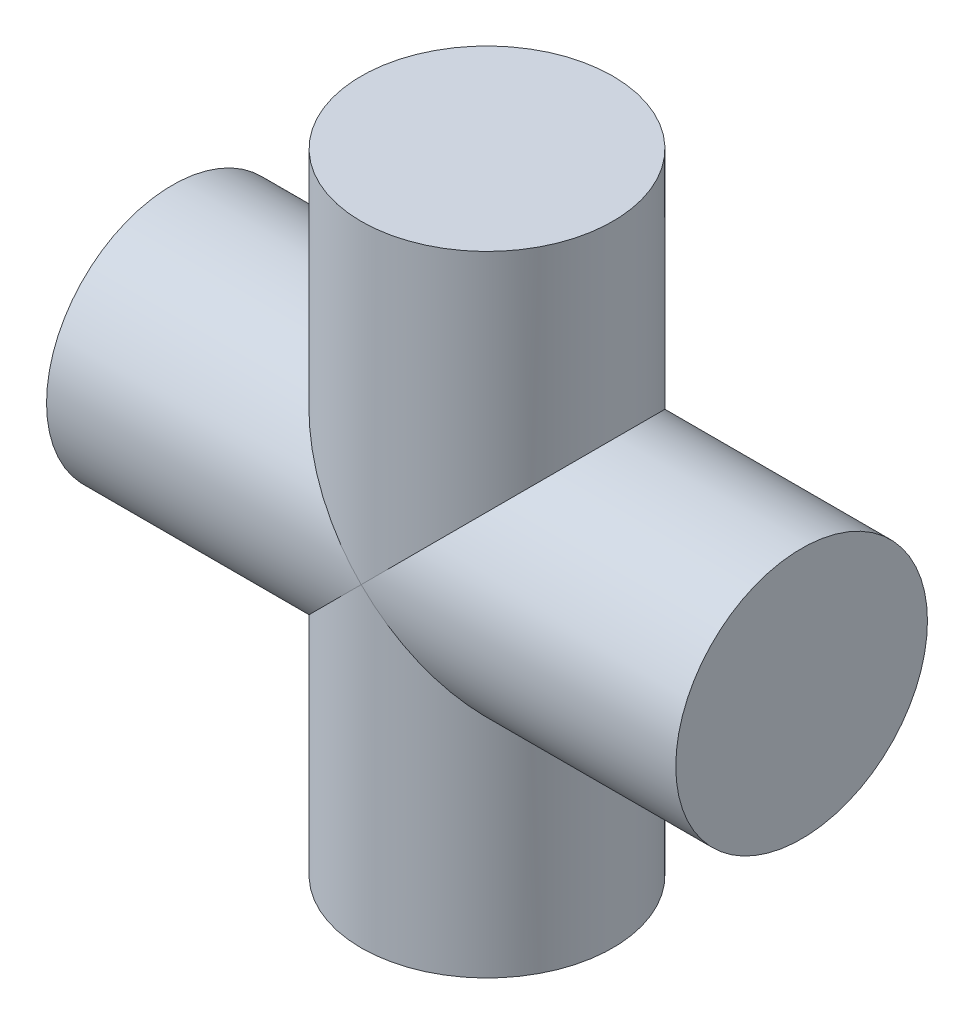
ISO-10303-21;
HEADER;
FILE_DESCRIPTION(('STEP AP214'),'2;1');
FILE_NAME('part.step','',(''),(''),'','','');
FILE_SCHEMA(('AUTOMOTIVE_DESIGN { 1 0 10303 214 1 1 1 1 }'));
ENDSEC;
DATA;
#1=APPLICATION_CONTEXT('core data for automotive mechanical design processes');
#2=APPLICATION_PROTOCOL_DEFINITION('international standard','automotive_design',2000,#1);
#3=PRODUCT_CONTEXT('',#1,'mechanical');
#4=PRODUCT('Part','Part','',(#3));
#5=PRODUCT_RELATED_PRODUCT_CATEGORY('part','',(#4));
#6=PRODUCT_DEFINITION_FORMATION('','',#4);
#7=PRODUCT_DEFINITION_CONTEXT('part definition',#1,'design');
#8=PRODUCT_DEFINITION('design','',#6,#7);
#9=PRODUCT_DEFINITION_SHAPE('','',#8);
#10=(LENGTH_UNIT() NAMED_UNIT(*) SI_UNIT(.MILLI.,.METRE.));
#11=(NAMED_UNIT(*) PLANE_ANGLE_UNIT() SI_UNIT($,.RADIAN.));
#12=(NAMED_UNIT(*) SI_UNIT($,.STERADIAN.) SOLID_ANGLE_UNIT());
#13=UNCERTAINTY_MEASURE_WITH_UNIT(LENGTH_MEASURE(1.E-05),#10,'distance_accuracy_value','');
#14=(GEOMETRIC_REPRESENTATION_CONTEXT(3) GLOBAL_UNCERTAINTY_ASSIGNED_CONTEXT((#13)) GLOBAL_UNIT_ASSIGNED_CONTEXT((#10,
#11,#12)) REPRESENTATION_CONTEXT('',''));
#15=CARTESIAN_POINT('',(0.,0.,0.));
#16=DIRECTION('',(0.,0.,1.));
#17=DIRECTION('',(1.,0.,0.));
#18=AXIS2_PLACEMENT_3D('',#15,#16,#17);
#19=CARTESIAN_POINT('',(0.,-20.,0.));
#20=DIRECTION('',(0.,1.,0.));
#21=DIRECTION('',(0.,0.,1.));
#22=AXIS2_PLACEMENT_3D('',#19,#20,#21);
#23=CYLINDRICAL_SURFACE('',#22,8.);
#24=CARTESIAN_POINT('',(0.,0.,0.));
#25=DIRECTION('',(0.707106781186547,0.707106781186547,0.));
#26=DIRECTION('',(-0.707106781186547,0.707106781186547,0.));
#27=AXIS2_PLACEMENT_3D('',#24,#25,#26);
#28=ELLIPSE('',#27,11.3137084989848,8.);
#29=CARTESIAN_POINT('',(0.,0.,8.));
#30=VERTEX_POINT('',#29);
#31=CARTESIAN_POINT('',(0.,0.,-8.));
#32=VERTEX_POINT('',#31);
#33=EDGE_CURVE('E47',#30,#32,#28,.T.);
#34=ORIENTED_EDGE('',*,*,#33,.F.);
#35=CARTESIAN_POINT('',(0.,0.,0.));
#36=DIRECTION('',(-0.707106781186547,0.707106781186547,0.));
#37=DIRECTION('',(0.707106781186547,0.707106781186547,0.));
#38=AXIS2_PLACEMENT_3D('',#35,#36,#37);
#39=ELLIPSE('',#38,11.3137084989848,8.);
#40=EDGE_CURVE('E59',#32,#30,#39,.T.);
#41=ORIENTED_EDGE('',*,*,#40,.F.);
#42=EDGE_LOOP('',(#34,#41));
#43=FACE_BOUND('',#42,.T.);
#44=CARTESIAN_POINT('',(0.,-20.,0.));
#45=DIRECTION('',(0.,1.,0.));
#46=DIRECTION('',(0.,0.,1.));
#47=AXIS2_PLACEMENT_3D('',#44,#45,#46);
#48=CIRCLE('',#47,8.);
#49=CARTESIAN_POINT('',(0.,-20.,8.));
#50=VERTEX_POINT('',#49);
#51=EDGE_CURVE('E68',#50,#50,#48,.T.);
#52=ORIENTED_EDGE('',*,*,#51,.T.);
#53=EDGE_LOOP('',(#52));
#54=FACE_BOUND('',#53,.T.);
#55=ADVANCED_FACE('F39',(#43,#54),#23,.T.);
#56=CARTESIAN_POINT('',(0.,-20.,0.));
#57=DIRECTION('',(0.,1.,0.));
#58=DIRECTION('',(0.,0.,1.));
#59=AXIS2_PLACEMENT_3D('',#56,#57,#58);
#60=PLANE('',#59);
#61=ORIENTED_EDGE('',*,*,#51,.F.);
#62=EDGE_LOOP('',(#61));
#63=FACE_BOUND('',#62,.T.);
#64=ADVANCED_FACE('F96',(#63),#60,.F.);
#65=CARTESIAN_POINT('',(20.,0.,0.));
#66=DIRECTION('',(1.,0.,0.));
#67=DIRECTION('',(0.,0.,-1.));
#68=AXIS2_PLACEMENT_3D('',#65,#66,#67);
#69=PLANE('',#68);
#70=CARTESIAN_POINT('',(20.,0.,0.));
#71=DIRECTION('',(1.,0.,0.));
#72=DIRECTION('',(0.,0.,-1.));
#73=AXIS2_PLACEMENT_3D('',#70,#71,#72);
#74=CIRCLE('',#73,8.);
#75=CARTESIAN_POINT('',(20.,0.,-8.));
#76=VERTEX_POINT('',#75);
#77=EDGE_CURVE('E83',#76,#76,#74,.T.);
#78=ORIENTED_EDGE('',*,*,#77,.T.);
#79=EDGE_LOOP('',(#78));
#80=FACE_BOUND('',#79,.T.);
#81=ADVANCED_FACE('F98',(#80),#69,.T.);
#82=CARTESIAN_POINT('',(-20.,0.,0.));
#83=DIRECTION('',(1.,0.,0.));
#84=DIRECTION('',(0.,0.,-1.));
#85=AXIS2_PLACEMENT_3D('',#82,#83,#84);
#86=CYLINDRICAL_SURFACE('',#85,8.);
#87=ORIENTED_EDGE('',*,*,#77,.F.);
#88=EDGE_LOOP('',(#87));
#89=FACE_BOUND('',#88,.T.);
#90=CARTESIAN_POINT('',(0.,0.,0.));
#91=DIRECTION('',(-0.707106781186547,0.707106781186547,0.));
#92=DIRECTION('',(0.707106781186547,0.707106781186547,0.));
#93=AXIS2_PLACEMENT_3D('',#90,#91,#92);
#94=ELLIPSE('',#93,11.3137084989848,8.);
#95=EDGE_CURVE('E53',#32,#30,#94,.F.);
#96=ORIENTED_EDGE('',*,*,#95,.T.);
#97=ORIENTED_EDGE('',*,*,#33,.T.);
#98=EDGE_LOOP('',(#96,#97));
#99=FACE_BOUND('',#98,.T.);
#100=ADVANCED_FACE('F70',(#89,#99),#86,.T.);
#101=CARTESIAN_POINT('',(0.,20.,0.));
#102=DIRECTION('',(0.,1.,0.));
#103=DIRECTION('',(0.,0.,1.));
#104=AXIS2_PLACEMENT_3D('',#101,#102,#103);
#105=PLANE('',#104);
#106=CARTESIAN_POINT('',(0.,20.,0.));
#107=DIRECTION('',(0.,1.,0.));
#108=DIRECTION('',(0.,0.,1.));
#109=AXIS2_PLACEMENT_3D('',#106,#107,#108);
#110=CIRCLE('',#109,8.);
#111=CARTESIAN_POINT('',(0.,20.,8.));
#112=VERTEX_POINT('',#111);
#113=EDGE_CURVE('E82',#112,#112,#110,.T.);
#114=ORIENTED_EDGE('',*,*,#113,.T.);
#115=EDGE_LOOP('',(#114));
#116=FACE_BOUND('',#115,.T.);
#117=ADVANCED_FACE('F106',(#116),#105,.T.);
#118=CARTESIAN_POINT('',(0.,0.,0.));
#119=DIRECTION('',(0.707106781186547,0.707106781186547,0.));
#120=DIRECTION('',(-0.707106781186547,0.707106781186547,0.));
#121=AXIS2_PLACEMENT_3D('',#118,#119,#120);
#122=ELLIPSE('',#121,11.3137084989848,8.);
#123=EDGE_CURVE('E11',#30,#32,#122,.F.);
#124=ORIENTED_EDGE('',*,*,#123,.F.);
#125=ORIENTED_EDGE('',*,*,#95,.F.);
#126=EDGE_LOOP('',(#124,#125));
#127=FACE_BOUND('',#126,.T.);
#128=ORIENTED_EDGE('',*,*,#113,.F.);
#129=EDGE_LOOP('',(#128));
#130=FACE_BOUND('',#129,.T.);
#131=ADVANCED_FACE('F65',(#127,#130),#23,.T.);
#132=ORIENTED_EDGE('',*,*,#40,.T.);
#133=ORIENTED_EDGE('',*,*,#123,.T.);
#134=EDGE_LOOP('',(#132,#133));
#135=FACE_BOUND('',#134,.T.);
#136=CARTESIAN_POINT('',(-20.,0.,0.));
#137=DIRECTION('',(1.,0.,0.));
#138=DIRECTION('',(0.,0.,-1.));
#139=AXIS2_PLACEMENT_3D('',#136,#137,#138);
#140=CIRCLE('',#139,8.);
#141=CARTESIAN_POINT('',(-20.,0.,-8.));
#142=VERTEX_POINT('',#141);
#143=EDGE_CURVE('E79',#142,#142,#140,.T.);
#144=ORIENTED_EDGE('',*,*,#143,.T.);
#145=EDGE_LOOP('',(#144));
#146=FACE_BOUND('',#145,.T.);
#147=ADVANCED_FACE('F72',(#135,#146),#86,.T.);
#148=CARTESIAN_POINT('',(-20.,0.,0.));
#149=DIRECTION('',(1.,0.,0.));
#150=DIRECTION('',(0.,0.,-1.));
#151=AXIS2_PLACEMENT_3D('',#148,#149,#150);
#152=PLANE('',#151);
#153=ORIENTED_EDGE('',*,*,#143,.F.);
#154=EDGE_LOOP('',(#153));
#155=FACE_BOUND('',#154,.T.);
#156=ADVANCED_FACE('F75',(#155),#152,.F.);
#157=CLOSED_SHELL('',(#55,#64,#81,#100,#117,#131,#147,#156));
#158=MANIFOLD_SOLID_BREP('B2',#157);
#159=ADVANCED_BREP_SHAPE_REPRESENTATION('',(#18,#158),#14);
#160=SHAPE_DEFINITION_REPRESENTATION(#9,#159);
ENDSEC;
END-ISO-10303-21;
